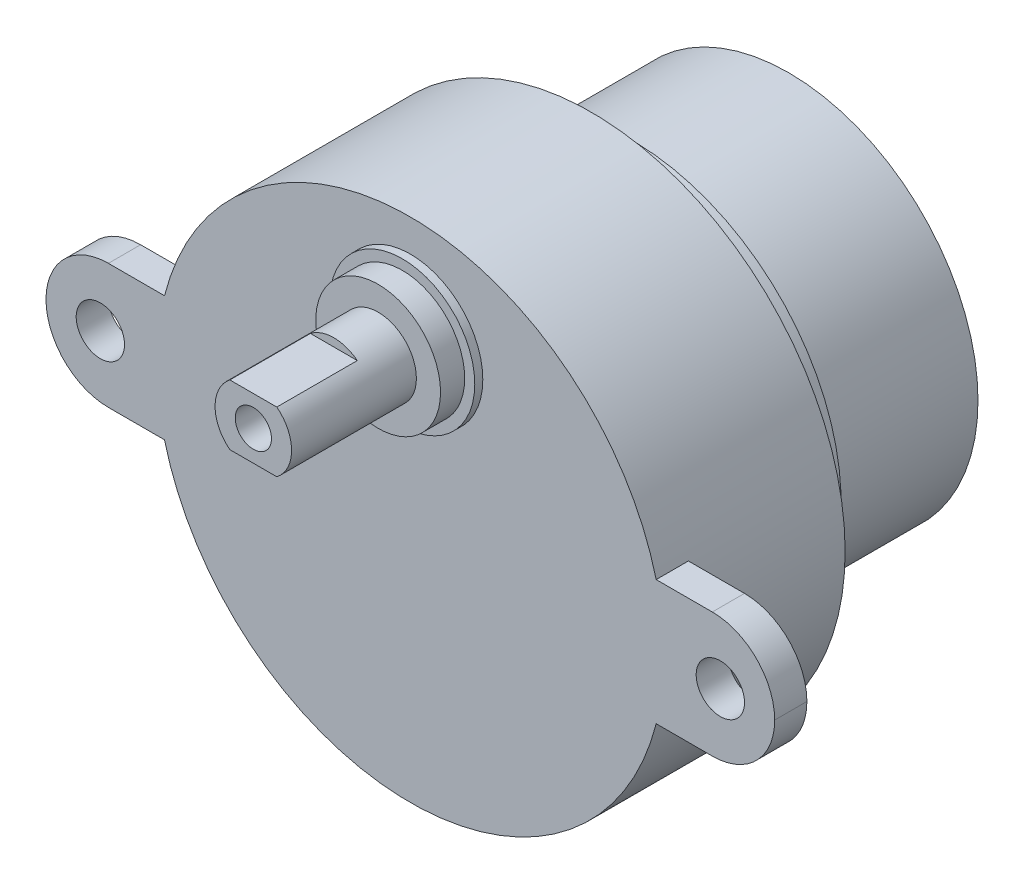
ISO-10303-21;
HEADER;
FILE_DESCRIPTION(('STEP AP214'),'2;1');
FILE_NAME('part.step','',(''),(''),'','','');
FILE_SCHEMA(('AUTOMOTIVE_DESIGN { 1 0 10303 214 1 1 1 1 }'));
ENDSEC;
DATA;
#1=APPLICATION_CONTEXT('core data for automotive mechanical design processes');
#2=APPLICATION_PROTOCOL_DEFINITION('international standard','automotive_design',2000,#1);
#3=PRODUCT_CONTEXT('',#1,'mechanical');
#4=PRODUCT('Part','Part','',(#3));
#5=PRODUCT_RELATED_PRODUCT_CATEGORY('part','',(#4));
#6=PRODUCT_DEFINITION_FORMATION('','',#4);
#7=PRODUCT_DEFINITION_CONTEXT('part definition',#1,'design');
#8=PRODUCT_DEFINITION('design','',#6,#7);
#9=PRODUCT_DEFINITION_SHAPE('','',#8);
#10=(LENGTH_UNIT() NAMED_UNIT(*) SI_UNIT(.MILLI.,.METRE.));
#11=(NAMED_UNIT(*) PLANE_ANGLE_UNIT() SI_UNIT($,.RADIAN.));
#12=(NAMED_UNIT(*) SI_UNIT($,.STERADIAN.) SOLID_ANGLE_UNIT());
#13=UNCERTAINTY_MEASURE_WITH_UNIT(LENGTH_MEASURE(1.E-05),#10,'distance_accuracy_value','');
#14=(GEOMETRIC_REPRESENTATION_CONTEXT(3) GLOBAL_UNCERTAINTY_ASSIGNED_CONTEXT((#13)) GLOBAL_UNIT_ASSIGNED_CONTEXT((#10,
#11,#12)) REPRESENTATION_CONTEXT('',''));
#15=CARTESIAN_POINT('',(0.,0.,0.));
#16=DIRECTION('',(0.,0.,1.));
#17=DIRECTION('',(1.,0.,0.));
#18=AXIS2_PLACEMENT_3D('',#15,#16,#17);
#19=CARTESIAN_POINT('',(0.,0.,-13.97));
#20=DIRECTION('',(0.,0.,1.));
#21=DIRECTION('',(1.,0.,0.));
#22=AXIS2_PLACEMENT_3D('',#19,#20,#21);
#23=PLANE('',#22);
#24=CARTESIAN_POINT('',(0.,0.,-13.97));
#25=DIRECTION('',(0.,0.,-1.));
#26=DIRECTION('',(-1.,0.,0.));
#27=AXIS2_PLACEMENT_3D('',#24,#25,#26);
#28=CIRCLE('',#27,11.938);
#29=CARTESIAN_POINT('',(-11.938,0.,-13.97));
#30=VERTEX_POINT('',#29);
#31=EDGE_CURVE('E244',#30,#30,#28,.T.);
#32=ORIENTED_EDGE('',*,*,#31,.F.);
#33=EDGE_LOOP('',(#32));
#34=FACE_BOUND('',#33,.T.);
#35=CARTESIAN_POINT('',(0.,0.,-13.97));
#36=DIRECTION('',(0.,0.,-1.));
#37=DIRECTION('',(-1.,0.,0.));
#38=AXIS2_PLACEMENT_3D('',#35,#36,#37);
#39=CIRCLE('',#38,13.208);
#40=CARTESIAN_POINT('',(-13.208,0.,-13.97));
#41=VERTEX_POINT('',#40);
#42=EDGE_CURVE('E227',#41,#41,#39,.T.);
#43=ORIENTED_EDGE('',*,*,#42,.T.);
#44=EDGE_LOOP('',(#43));
#45=FACE_BOUND('',#44,.T.);
#46=ADVANCED_FACE('F51',(#34,#45),#23,.F.);
#47=CARTESIAN_POINT('',(0.,0.,-23.876));
#48=DIRECTION('',(0.,0.,1.));
#49=DIRECTION('',(1.,0.,0.));
#50=AXIS2_PLACEMENT_3D('',#47,#48,#49);
#51=CYLINDRICAL_SURFACE('',#50,11.938);
#52=CARTESIAN_POINT('',(0.,0.,-23.876));
#53=DIRECTION('',(0.,0.,-1.));
#54=DIRECTION('',(-1.,0.,0.));
#55=AXIS2_PLACEMENT_3D('',#52,#53,#54);
#56=CIRCLE('',#55,11.938);
#57=CARTESIAN_POINT('',(-11.938,0.,-23.876));
#58=VERTEX_POINT('',#57);
#59=EDGE_CURVE('E240',#58,#58,#56,.T.);
#60=ORIENTED_EDGE('',*,*,#59,.F.);
#61=EDGE_LOOP('',(#60));
#62=FACE_BOUND('',#61,.T.);
#63=ORIENTED_EDGE('',*,*,#31,.T.);
#64=EDGE_LOOP('',(#63));
#65=FACE_BOUND('',#64,.T.);
#66=ADVANCED_FACE('F314',(#62,#65),#51,.T.);
#67=CARTESIAN_POINT('',(0.,0.,-23.876));
#68=DIRECTION('',(0.,0.,-1.));
#69=DIRECTION('',(-1.,0.,0.));
#70=AXIS2_PLACEMENT_3D('',#67,#68,#69);
#71=PLANE('',#70);
#72=ORIENTED_EDGE('',*,*,#59,.T.);
#73=EDGE_LOOP('',(#72));
#74=FACE_BOUND('',#73,.T.);
#75=ADVANCED_FACE('F321',(#74),#71,.T.);
#76=CARTESIAN_POINT('',(0.,0.,-11.43));
#77=DIRECTION('',(0.,0.,-1.));
#78=DIRECTION('',(-1.,0.,0.));
#79=AXIS2_PLACEMENT_3D('',#76,#77,#78);
#80=PLANE('',#79);
#81=CARTESIAN_POINT('',(0.,0.,-11.43));
#82=DIRECTION('',(0.,0.,-1.));
#83=DIRECTION('',(-1.,0.,0.));
#84=AXIS2_PLACEMENT_3D('',#81,#82,#83);
#85=CIRCLE('',#84,13.208);
#86=CARTESIAN_POINT('',(-13.208,0.,-11.43));
#87=VERTEX_POINT('',#86);
#88=EDGE_CURVE('E232',#87,#87,#85,.T.);
#89=ORIENTED_EDGE('',*,*,#88,.F.);
#90=EDGE_LOOP('',(#89));
#91=FACE_BOUND('',#90,.T.);
#92=CARTESIAN_POINT('',(0.,0.,-11.43));
#93=DIRECTION('',(0.,0.,-1.));
#94=DIRECTION('',(-1.,0.,0.));
#95=AXIS2_PLACEMENT_3D('',#92,#93,#94);
#96=CIRCLE('',#95,16.002);
#97=CARTESIAN_POINT('',(-16.002,0.,-11.43));
#98=VERTEX_POINT('',#97);
#99=EDGE_CURVE('E235',#98,#98,#96,.T.);
#100=ORIENTED_EDGE('',*,*,#99,.T.);
#101=EDGE_LOOP('',(#100));
#102=FACE_BOUND('',#101,.T.);
#103=ADVANCED_FACE('F640',(#91,#102),#80,.T.);
#104=CARTESIAN_POINT('',(0.,0.,-11.43));
#105=DIRECTION('',(0.,0.,-1.));
#106=DIRECTION('',(-1.,0.,0.));
#107=AXIS2_PLACEMENT_3D('',#104,#105,#106);
#108=CYLINDRICAL_SURFACE('',#107,13.208);
#109=ORIENTED_EDGE('',*,*,#88,.T.);
#110=EDGE_LOOP('',(#109));
#111=FACE_BOUND('',#110,.T.);
#112=ORIENTED_EDGE('',*,*,#42,.F.);
#113=EDGE_LOOP('',(#112));
#114=FACE_BOUND('',#113,.T.);
#115=ADVANCED_FACE('F330',(#111,#114),#108,.T.);
#116=CARTESIAN_POINT('',(0.,0.,0.));
#117=DIRECTION('',(0.,0.,1.));
#118=DIRECTION('',(1.,0.,0.));
#119=AXIS2_PLACEMENT_3D('',#116,#117,#118);
#120=PLANE('',#119);
#121=CARTESIAN_POINT('',(0.,9.398,0.));
#122=DIRECTION('',(0.,0.,1.));
#123=DIRECTION('',(1.,0.,0.));
#124=AXIS2_PLACEMENT_3D('',#121,#122,#123);
#125=CIRCLE('',#124,4.572);
#126=CARTESIAN_POINT('',(4.572,9.398,0.));
#127=VERTEX_POINT('',#126);
#128=EDGE_CURVE('E192',#127,#127,#125,.T.);
#129=ORIENTED_EDGE('',*,*,#128,.F.);
#130=EDGE_LOOP('',(#129));
#131=FACE_BOUND('',#130,.T.);
#132=CARTESIAN_POINT('',(-19.558,0.,0.));
#133=DIRECTION('',(0.,0.,1.));
#134=DIRECTION('',(1.,0.,0.));
#135=AXIS2_PLACEMENT_3D('',#132,#133,#134);
#136=CIRCLE('',#135,1.524);
#137=CARTESIAN_POINT('',(-18.034,0.,0.));
#138=VERTEX_POINT('',#137);
#139=EDGE_CURVE('E216',#138,#138,#136,.T.);
#140=ORIENTED_EDGE('',*,*,#139,.F.);
#141=EDGE_LOOP('',(#140));
#142=FACE_BOUND('',#141,.T.);
#143=CARTESIAN_POINT('',(19.558,0.,0.));
#144=DIRECTION('',(0.,0.,1.));
#145=DIRECTION('',(1.,0.,0.));
#146=AXIS2_PLACEMENT_3D('',#143,#144,#145);
#147=CIRCLE('',#146,1.524);
#148=CARTESIAN_POINT('',(21.082,0.,0.));
#149=VERTEX_POINT('',#148);
#150=EDGE_CURVE('E220',#149,#149,#147,.T.);
#151=ORIENTED_EDGE('',*,*,#150,.F.);
#152=EDGE_LOOP('',(#151));
#153=FACE_BOUND('',#152,.T.);
#154=CARTESIAN_POINT('',(19.05,0.,0.));
#155=DIRECTION('',(0.,0.,1.));
#156=DIRECTION('',(1.,0.,0.));
#157=AXIS2_PLACEMENT_3D('',#154,#155,#156);
#158=CIRCLE('',#157,3.937);
#159=CARTESIAN_POINT('',(19.05,-3.937,0.));
#160=VERTEX_POINT('',#159);
#161=CARTESIAN_POINT('',(22.987,0.,0.));
#162=VERTEX_POINT('',#161);
#163=EDGE_CURVE('E270',#160,#162,#158,.T.);
#164=ORIENTED_EDGE('',*,*,#163,.T.);
#165=CARTESIAN_POINT('',(19.05,0.,0.));
#166=DIRECTION('',(0.,0.,1.));
#167=DIRECTION('',(1.,0.,0.));
#168=AXIS2_PLACEMENT_3D('',#165,#166,#167);
#169=CIRCLE('',#168,3.937);
#170=CARTESIAN_POINT('',(19.05,3.937,0.));
#171=VERTEX_POINT('',#170);
#172=EDGE_CURVE('E272',#162,#171,#169,.T.);
#173=ORIENTED_EDGE('',*,*,#172,.T.);
#174=DIRECTION('',(-1.,0.,0.));
#175=VECTOR('',#174,1.);
#176=CARTESIAN_POINT('',(-22.987,3.937,0.));
#177=LINE('',#176,#175);
#178=CARTESIAN_POINT('',(15.5101268531241,3.937,0.));
#179=VERTEX_POINT('',#178);
#180=EDGE_CURVE('E228',#171,#179,#177,.T.);
#181=ORIENTED_EDGE('',*,*,#180,.T.);
#182=CARTESIAN_POINT('',(0.,0.,0.));
#183=DIRECTION('',(0.,0.,1.));
#184=DIRECTION('',(1.,0.,0.));
#185=AXIS2_PLACEMENT_3D('',#182,#183,#184);
#186=CIRCLE('',#185,16.002);
#187=CARTESIAN_POINT('',(-15.5101268531241,3.937,0.));
#188=VERTEX_POINT('',#187);
#189=EDGE_CURVE('E248',#179,#188,#186,.T.);
#190=ORIENTED_EDGE('',*,*,#189,.T.);
#191=CARTESIAN_POINT('',(-19.05,3.937,0.));
#192=VERTEX_POINT('',#191);
#193=EDGE_CURVE('E222',#188,#192,#177,.T.);
#194=ORIENTED_EDGE('',*,*,#193,.T.);
#195=CARTESIAN_POINT('',(-19.05,0.,0.));
#196=DIRECTION('',(0.,0.,1.));
#197=DIRECTION('',(1.,0.,0.));
#198=AXIS2_PLACEMENT_3D('',#195,#196,#197);
#199=CIRCLE('',#198,3.937);
#200=CARTESIAN_POINT('',(-22.987,0.,0.));
#201=VERTEX_POINT('',#200);
#202=EDGE_CURVE('E178',#192,#201,#199,.T.);
#203=ORIENTED_EDGE('',*,*,#202,.T.);
#204=CARTESIAN_POINT('',(-19.05,0.,0.));
#205=DIRECTION('',(0.,0.,1.));
#206=DIRECTION('',(1.,0.,0.));
#207=AXIS2_PLACEMENT_3D('',#204,#205,#206);
#208=CIRCLE('',#207,3.937);
#209=CARTESIAN_POINT('',(-19.05,-3.937,0.));
#210=VERTEX_POINT('',#209);
#211=EDGE_CURVE('E268',#201,#210,#208,.T.);
#212=ORIENTED_EDGE('',*,*,#211,.T.);
#213=DIRECTION('',(1.,0.,0.));
#214=VECTOR('',#213,1.);
#215=CARTESIAN_POINT('',(-22.987,-3.937,0.));
#216=LINE('',#215,#214);
#217=CARTESIAN_POINT('',(-15.5101268531241,-3.937,0.));
#218=VERTEX_POINT('',#217);
#219=EDGE_CURVE('E175',#210,#218,#216,.T.);
#220=ORIENTED_EDGE('',*,*,#219,.T.);
#221=CARTESIAN_POINT('',(15.5101268531241,-3.937,0.));
#222=VERTEX_POINT('',#221);
#223=EDGE_CURVE('E243',#218,#222,#186,.T.);
#224=ORIENTED_EDGE('',*,*,#223,.T.);
#225=EDGE_CURVE('E230',#222,#160,#216,.T.);
#226=ORIENTED_EDGE('',*,*,#225,.T.);
#227=EDGE_LOOP('',(#164,#173,#181,#190,#194,#203,#212,#220,#224,#226));
#228=FACE_BOUND('',#227,.T.);
#229=ADVANCED_FACE('F299',(#131,#142,#153,#228),#120,.T.);
#230=CARTESIAN_POINT('',(0.,0.,-13.97));
#231=DIRECTION('',(0.,0.,1.));
#232=DIRECTION('',(1.,0.,0.));
#233=AXIS2_PLACEMENT_3D('',#230,#231,#232);
#234=CYLINDRICAL_SURFACE('',#233,16.002);
#235=DIRECTION('',(0.,0.,1.));
#236=VECTOR('',#235,1.);
#237=CARTESIAN_POINT('',(-15.5101268531241,-3.937,-13.97));
#238=LINE('',#237,#236);
#239=CARTESIAN_POINT('',(-15.5101268531241,-3.937,-2.032));
#240=VERTEX_POINT('',#239);
#241=EDGE_CURVE('E260',#240,#218,#238,.T.);
#242=ORIENTED_EDGE('',*,*,#241,.F.);
#243=CARTESIAN_POINT('',(0.,0.,-2.032));
#244=DIRECTION('',(0.,0.,1.));
#245=DIRECTION('',(1.,0.,0.));
#246=AXIS2_PLACEMENT_3D('',#243,#244,#245);
#247=CIRCLE('',#246,16.002);
#248=CARTESIAN_POINT('',(-15.5101268531241,3.937,-2.032));
#249=VERTEX_POINT('',#248);
#250=EDGE_CURVE('E254',#240,#249,#247,.F.);
#251=ORIENTED_EDGE('',*,*,#250,.T.);
#252=DIRECTION('',(0.,0.,1.));
#253=VECTOR('',#252,1.);
#254=CARTESIAN_POINT('',(-15.5101268531241,3.937,-13.97));
#255=LINE('',#254,#253);
#256=EDGE_CURVE('E173',#188,#249,#255,.F.);
#257=ORIENTED_EDGE('',*,*,#256,.F.);
#258=ORIENTED_EDGE('',*,*,#189,.F.);
#259=DIRECTION('',(0.,0.,1.));
#260=VECTOR('',#259,1.);
#261=CARTESIAN_POINT('',(15.5101268531241,3.937,-13.97));
#262=LINE('',#261,#260);
#263=CARTESIAN_POINT('',(15.5101268531241,3.937,-2.032));
#264=VERTEX_POINT('',#263);
#265=EDGE_CURVE('E253',#264,#179,#262,.T.);
#266=ORIENTED_EDGE('',*,*,#265,.F.);
#267=CARTESIAN_POINT('',(15.5101268531241,-3.937,-2.032));
#268=VERTEX_POINT('',#267);
#269=EDGE_CURVE('E247',#264,#268,#247,.F.);
#270=ORIENTED_EDGE('',*,*,#269,.T.);
#271=DIRECTION('',(0.,0.,1.));
#272=VECTOR('',#271,1.);
#273=CARTESIAN_POINT('',(15.5101268531241,-3.937,-13.97));
#274=LINE('',#273,#272);
#275=EDGE_CURVE('E257',#222,#268,#274,.F.);
#276=ORIENTED_EDGE('',*,*,#275,.F.);
#277=ORIENTED_EDGE('',*,*,#223,.F.);
#278=EDGE_LOOP('',(#242,#251,#257,#258,#266,#270,#276,#277));
#279=FACE_BOUND('',#278,.T.);
#280=ORIENTED_EDGE('',*,*,#99,.F.);
#281=EDGE_LOOP('',(#280));
#282=FACE_BOUND('',#281,.T.);
#283=ADVANCED_FACE('F293',(#279,#282),#234,.T.);
#284=CARTESIAN_POINT('',(0.,0.,-2.032));
#285=DIRECTION('',(0.,0.,1.));
#286=DIRECTION('',(1.,0.,0.));
#287=AXIS2_PLACEMENT_3D('',#284,#285,#286);
#288=PLANE('',#287);
#289=CARTESIAN_POINT('',(19.558,0.,-2.032));
#290=DIRECTION('',(0.,0.,1.));
#291=DIRECTION('',(1.,0.,0.));
#292=AXIS2_PLACEMENT_3D('',#289,#290,#291);
#293=CIRCLE('',#292,1.524);
#294=CARTESIAN_POINT('',(21.082,0.,-2.032));
#295=VERTEX_POINT('',#294);
#296=EDGE_CURVE('E219',#295,#295,#293,.T.);
#297=ORIENTED_EDGE('',*,*,#296,.T.);
#298=EDGE_LOOP('',(#297));
#299=FACE_BOUND('',#298,.T.);
#300=DIRECTION('',(-1.,0.,0.));
#301=VECTOR('',#300,1.);
#302=CARTESIAN_POINT('',(-22.987,3.937,-2.032));
#303=LINE('',#302,#301);
#304=CARTESIAN_POINT('',(19.05,3.937,-2.032));
#305=VERTEX_POINT('',#304);
#306=EDGE_CURVE('E174',#305,#264,#303,.T.);
#307=ORIENTED_EDGE('',*,*,#306,.F.);
#308=CARTESIAN_POINT('',(19.05,0.,-2.032));
#309=DIRECTION('',(0.,0.,1.));
#310=DIRECTION('',(1.,0.,0.));
#311=AXIS2_PLACEMENT_3D('',#308,#309,#310);
#312=CIRCLE('',#311,3.937);
#313=CARTESIAN_POINT('',(22.987,0.,-2.032));
#314=VERTEX_POINT('',#313);
#315=EDGE_CURVE('E279',#305,#314,#312,.F.);
#316=ORIENTED_EDGE('',*,*,#315,.T.);
#317=CARTESIAN_POINT('',(19.05,0.,-2.032));
#318=DIRECTION('',(0.,0.,1.));
#319=DIRECTION('',(1.,0.,0.));
#320=AXIS2_PLACEMENT_3D('',#317,#318,#319);
#321=CIRCLE('',#320,3.937);
#322=CARTESIAN_POINT('',(19.05,-3.937,-2.032));
#323=VERTEX_POINT('',#322);
#324=EDGE_CURVE('E277',#314,#323,#321,.F.);
#325=ORIENTED_EDGE('',*,*,#324,.T.);
#326=DIRECTION('',(1.,0.,0.));
#327=VECTOR('',#326,1.);
#328=CARTESIAN_POINT('',(-22.987,-3.937,-2.032));
#329=LINE('',#328,#327);
#330=EDGE_CURVE('E224',#268,#323,#329,.T.);
#331=ORIENTED_EDGE('',*,*,#330,.F.);
#332=ORIENTED_EDGE('',*,*,#269,.F.);
#333=EDGE_LOOP('',(#307,#316,#325,#331,#332));
#334=FACE_BOUND('',#333,.T.);
#335=ADVANCED_FACE('F334',(#299,#334),#288,.F.);
#336=CARTESIAN_POINT('',(-22.987,3.937,-2.032));
#337=DIRECTION('',(0.,1.,0.));
#338=DIRECTION('',(0.,0.,1.));
#339=AXIS2_PLACEMENT_3D('',#336,#337,#338);
#340=PLANE('',#339);
#341=ORIENTED_EDGE('',*,*,#180,.F.);
#342=DIRECTION('',(0.,0.,1.));
#343=VECTOR('',#342,1.);
#344=CARTESIAN_POINT('',(19.05,3.937,-2.032));
#345=LINE('',#344,#343);
#346=EDGE_CURVE('E274',#171,#305,#345,.F.);
#347=ORIENTED_EDGE('',*,*,#346,.T.);
#348=ORIENTED_EDGE('',*,*,#306,.T.);
#349=ORIENTED_EDGE('',*,*,#265,.T.);
#350=EDGE_LOOP('',(#341,#347,#348,#349));
#351=FACE_BOUND('',#350,.T.);
#352=ADVANCED_FACE('F361',(#351),#340,.T.);
#353=CARTESIAN_POINT('',(-22.987,-3.937,-2.032));
#354=DIRECTION('',(0.,-1.,0.));
#355=DIRECTION('',(0.,0.,-1.));
#356=AXIS2_PLACEMENT_3D('',#353,#354,#355);
#357=PLANE('',#356);
#358=ORIENTED_EDGE('',*,*,#330,.T.);
#359=DIRECTION('',(0.,0.,1.));
#360=VECTOR('',#359,1.);
#361=CARTESIAN_POINT('',(19.05,-3.937,-2.032));
#362=LINE('',#361,#360);
#363=EDGE_CURVE('E281',#323,#160,#362,.T.);
#364=ORIENTED_EDGE('',*,*,#363,.T.);
#365=ORIENTED_EDGE('',*,*,#225,.F.);
#366=ORIENTED_EDGE('',*,*,#275,.T.);
#367=EDGE_LOOP('',(#358,#364,#365,#366));
#368=FACE_BOUND('',#367,.T.);
#369=ADVANCED_FACE('F352',(#368),#357,.T.);
#370=CARTESIAN_POINT('',(-19.05,3.937,-2.032));
#371=VERTEX_POINT('',#370);
#372=EDGE_CURVE('E160',#249,#371,#303,.T.);
#373=ORIENTED_EDGE('',*,*,#372,.T.);
#374=DIRECTION('',(0.,0.,1.));
#375=VECTOR('',#374,1.);
#376=CARTESIAN_POINT('',(-19.05,3.937,-2.032));
#377=LINE('',#376,#375);
#378=EDGE_CURVE('E170',#371,#192,#377,.T.);
#379=ORIENTED_EDGE('',*,*,#378,.T.);
#380=ORIENTED_EDGE('',*,*,#193,.F.);
#381=ORIENTED_EDGE('',*,*,#256,.T.);
#382=EDGE_LOOP('',(#373,#379,#380,#381));
#383=FACE_BOUND('',#382,.T.);
#384=ADVANCED_FACE('F169',(#383),#340,.T.);
#385=CARTESIAN_POINT('',(-19.558,0.,-2.032));
#386=DIRECTION('',(0.,0.,1.));
#387=DIRECTION('',(1.,0.,0.));
#388=AXIS2_PLACEMENT_3D('',#385,#386,#387);
#389=CIRCLE('',#388,1.524);
#390=CARTESIAN_POINT('',(-18.034,0.,-2.032));
#391=VERTEX_POINT('',#390);
#392=EDGE_CURVE('E185',#391,#391,#389,.T.);
#393=ORIENTED_EDGE('',*,*,#392,.T.);
#394=EDGE_LOOP('',(#393));
#395=FACE_BOUND('',#394,.T.);
#396=CARTESIAN_POINT('',(-19.05,-3.937,-2.032));
#397=VERTEX_POINT('',#396);
#398=EDGE_CURVE('E225',#397,#240,#329,.T.);
#399=ORIENTED_EDGE('',*,*,#398,.F.);
#400=CARTESIAN_POINT('',(-19.05,0.,-2.032));
#401=DIRECTION('',(0.,0.,1.));
#402=DIRECTION('',(1.,0.,0.));
#403=AXIS2_PLACEMENT_3D('',#400,#401,#402);
#404=CIRCLE('',#403,3.937);
#405=CARTESIAN_POINT('',(-22.987,0.,-2.032));
#406=VERTEX_POINT('',#405);
#407=EDGE_CURVE('E153',#397,#406,#404,.F.);
#408=ORIENTED_EDGE('',*,*,#407,.T.);
#409=CARTESIAN_POINT('',(-19.05,0.,-2.032));
#410=DIRECTION('',(0.,0.,1.));
#411=DIRECTION('',(1.,0.,0.));
#412=AXIS2_PLACEMENT_3D('',#409,#410,#411);
#413=CIRCLE('',#412,3.937);
#414=EDGE_CURVE('E156',#406,#371,#413,.F.);
#415=ORIENTED_EDGE('',*,*,#414,.T.);
#416=ORIENTED_EDGE('',*,*,#372,.F.);
#417=ORIENTED_EDGE('',*,*,#250,.F.);
#418=EDGE_LOOP('',(#399,#408,#415,#416,#417));
#419=FACE_BOUND('',#418,.T.);
#420=ADVANCED_FACE('F158',(#395,#419),#288,.F.);
#421=ORIENTED_EDGE('',*,*,#219,.F.);
#422=DIRECTION('',(0.,0.,1.));
#423=VECTOR('',#422,1.);
#424=CARTESIAN_POINT('',(-19.05,-3.937,-2.032));
#425=LINE('',#424,#423);
#426=EDGE_CURVE('E166',#210,#397,#425,.F.);
#427=ORIENTED_EDGE('',*,*,#426,.T.);
#428=ORIENTED_EDGE('',*,*,#398,.T.);
#429=ORIENTED_EDGE('',*,*,#241,.T.);
#430=EDGE_LOOP('',(#421,#427,#428,#429));
#431=FACE_BOUND('',#430,.T.);
#432=ADVANCED_FACE('F287',(#431),#357,.T.);
#433=CARTESIAN_POINT('',(-19.558,0.,-23.876));
#434=DIRECTION('',(0.,0.,1.));
#435=DIRECTION('',(1.,0.,0.));
#436=AXIS2_PLACEMENT_3D('',#433,#434,#435);
#437=CYLINDRICAL_SURFACE('',#436,1.524);
#438=ORIENTED_EDGE('',*,*,#139,.T.);
#439=EDGE_LOOP('',(#438));
#440=FACE_BOUND('',#439,.T.);
#441=ORIENTED_EDGE('',*,*,#392,.F.);
#442=EDGE_LOOP('',(#441));
#443=FACE_BOUND('',#442,.T.);
#444=ADVANCED_FACE('F344',(#440,#443),#437,.F.);
#445=CARTESIAN_POINT('',(19.558,0.,-23.876));
#446=DIRECTION('',(0.,0.,1.));
#447=DIRECTION('',(1.,0.,0.));
#448=AXIS2_PLACEMENT_3D('',#445,#446,#447);
#449=CYLINDRICAL_SURFACE('',#448,1.524);
#450=ORIENTED_EDGE('',*,*,#150,.T.);
#451=EDGE_LOOP('',(#450));
#452=FACE_BOUND('',#451,.T.);
#453=ORIENTED_EDGE('',*,*,#296,.F.);
#454=EDGE_LOOP('',(#453));
#455=FACE_BOUND('',#454,.T.);
#456=ADVANCED_FACE('F339',(#452,#455),#449,.F.);
#457=CARTESIAN_POINT('',(19.05,0.,-2.032));
#458=DIRECTION('',(0.,0.,1.));
#459=DIRECTION('',(1.,0.,0.));
#460=AXIS2_PLACEMENT_3D('',#457,#458,#459);
#461=CYLINDRICAL_SURFACE('',#460,3.937);
#462=ORIENTED_EDGE('',*,*,#363,.F.);
#463=ORIENTED_EDGE('',*,*,#324,.F.);
#464=DIRECTION('',(0.,0.,1.));
#465=VECTOR('',#464,1.);
#466=CARTESIAN_POINT('',(22.987,0.,-2.032));
#467=LINE('',#466,#465);
#468=EDGE_CURVE('E182',#162,#314,#467,.F.);
#469=ORIENTED_EDGE('',*,*,#468,.F.);
#470=ORIENTED_EDGE('',*,*,#163,.F.);
#471=EDGE_LOOP('',(#462,#463,#469,#470));
#472=FACE_BOUND('',#471,.T.);
#473=ADVANCED_FACE('F336',(#472),#461,.T.);
#474=CARTESIAN_POINT('',(19.05,0.,-2.032));
#475=DIRECTION('',(0.,0.,1.));
#476=DIRECTION('',(1.,0.,0.));
#477=AXIS2_PLACEMENT_3D('',#474,#475,#476);
#478=CYLINDRICAL_SURFACE('',#477,3.937);
#479=ORIENTED_EDGE('',*,*,#315,.F.);
#480=ORIENTED_EDGE('',*,*,#346,.F.);
#481=ORIENTED_EDGE('',*,*,#172,.F.);
#482=ORIENTED_EDGE('',*,*,#468,.T.);
#483=EDGE_LOOP('',(#479,#480,#481,#482));
#484=FACE_BOUND('',#483,.T.);
#485=ADVANCED_FACE('F311',(#484),#478,.T.);
#486=CARTESIAN_POINT('',(-19.05,0.,-2.032));
#487=DIRECTION('',(0.,0.,1.));
#488=DIRECTION('',(1.,0.,0.));
#489=AXIS2_PLACEMENT_3D('',#486,#487,#488);
#490=CYLINDRICAL_SURFACE('',#489,3.937);
#491=ORIENTED_EDGE('',*,*,#378,.F.);
#492=ORIENTED_EDGE('',*,*,#414,.F.);
#493=DIRECTION('',(0.,0.,1.));
#494=VECTOR('',#493,1.);
#495=CARTESIAN_POINT('',(-22.987,0.,-2.032));
#496=LINE('',#495,#494);
#497=EDGE_CURVE('E186',#201,#406,#496,.F.);
#498=ORIENTED_EDGE('',*,*,#497,.F.);
#499=ORIENTED_EDGE('',*,*,#202,.F.);
#500=EDGE_LOOP('',(#491,#492,#498,#499));
#501=FACE_BOUND('',#500,.T.);
#502=ADVANCED_FACE('F53',(#501),#490,.T.);
#503=CARTESIAN_POINT('',(-19.05,0.,-2.032));
#504=DIRECTION('',(0.,0.,1.));
#505=DIRECTION('',(1.,0.,0.));
#506=AXIS2_PLACEMENT_3D('',#503,#504,#505);
#507=CYLINDRICAL_SURFACE('',#506,3.937);
#508=ORIENTED_EDGE('',*,*,#407,.F.);
#509=ORIENTED_EDGE('',*,*,#426,.F.);
#510=ORIENTED_EDGE('',*,*,#211,.F.);
#511=ORIENTED_EDGE('',*,*,#497,.T.);
#512=EDGE_LOOP('',(#508,#509,#510,#511));
#513=FACE_BOUND('',#512,.T.);
#514=ADVANCED_FACE('F301',(#513),#507,.T.);
#515=CARTESIAN_POINT('',(0.,9.398,0.508));
#516=DIRECTION('',(0.,0.,-1.));
#517=DIRECTION('',(-1.,0.,0.));
#518=AXIS2_PLACEMENT_3D('',#515,#516,#517);
#519=CYLINDRICAL_SURFACE('',#518,4.572);
#520=CARTESIAN_POINT('',(0.,9.398,0.508));
#521=DIRECTION('',(0.,0.,1.));
#522=DIRECTION('',(1.,0.,0.));
#523=AXIS2_PLACEMENT_3D('',#520,#521,#522);
#524=CIRCLE('',#523,4.572);
#525=CARTESIAN_POINT('',(4.572,9.398,0.508));
#526=VERTEX_POINT('',#525);
#527=EDGE_CURVE('E188',#526,#526,#524,.T.);
#528=ORIENTED_EDGE('',*,*,#527,.F.);
#529=EDGE_LOOP('',(#528));
#530=FACE_BOUND('',#529,.T.);
#531=ORIENTED_EDGE('',*,*,#128,.T.);
#532=EDGE_LOOP('',(#531));
#533=FACE_BOUND('',#532,.T.);
#534=ADVANCED_FACE('F303',(#530,#533),#519,.T.);
#535=CARTESIAN_POINT('',(0.,9.398,0.508));
#536=DIRECTION('',(0.,0.,1.));
#537=DIRECTION('',(1.,0.,0.));
#538=AXIS2_PLACEMENT_3D('',#535,#536,#537);
#539=PLANE('',#538);
#540=CARTESIAN_POINT('',(0.,9.398,0.508));
#541=DIRECTION('',(0.,0.,1.));
#542=DIRECTION('',(1.,0.,0.));
#543=AXIS2_PLACEMENT_3D('',#540,#541,#542);
#544=CIRCLE('',#543,3.937);
#545=CARTESIAN_POINT('',(3.937,9.398,0.508));
#546=VERTEX_POINT('',#545);
#547=EDGE_CURVE('E189',#546,#546,#544,.F.);
#548=ORIENTED_EDGE('',*,*,#547,.T.);
#549=EDGE_LOOP('',(#548));
#550=FACE_BOUND('',#549,.T.);
#551=ORIENTED_EDGE('',*,*,#527,.T.);
#552=EDGE_LOOP('',(#551));
#553=FACE_BOUND('',#552,.T.);
#554=ADVANCED_FACE('F308',(#550,#553),#539,.T.);
#555=CARTESIAN_POINT('',(0.,9.398,2.032));
#556=DIRECTION('',(0.,0.,-1.));
#557=DIRECTION('',(-1.,0.,0.));
#558=AXIS2_PLACEMENT_3D('',#555,#556,#557);
#559=CYLINDRICAL_SURFACE('',#558,3.937);
#560=ORIENTED_EDGE('',*,*,#547,.F.);
#561=EDGE_LOOP('',(#560));
#562=FACE_BOUND('',#561,.T.);
#563=CARTESIAN_POINT('',(0.,9.398,2.032));
#564=DIRECTION('',(0.,0.,1.));
#565=DIRECTION('',(1.,0.,0.));
#566=AXIS2_PLACEMENT_3D('',#563,#564,#565);
#567=CIRCLE('',#566,3.937);
#568=CARTESIAN_POINT('',(3.937,9.398,2.032));
#569=VERTEX_POINT('',#568);
#570=EDGE_CURVE('E193',#569,#569,#567,.T.);
#571=ORIENTED_EDGE('',*,*,#570,.F.);
#572=EDGE_LOOP('',(#571));
#573=FACE_BOUND('',#572,.T.);
#574=ADVANCED_FACE('F388',(#562,#573),#559,.T.);
#575=CARTESIAN_POINT('',(0.,9.398,2.032));
#576=DIRECTION('',(0.,0.,1.));
#577=DIRECTION('',(1.,0.,0.));
#578=AXIS2_PLACEMENT_3D('',#575,#576,#577);
#579=PLANE('',#578);
#580=CARTESIAN_POINT('',(0.,9.398,2.032));
#581=DIRECTION('',(0.,0.,1.));
#582=DIRECTION('',(1.,0.,0.));
#583=AXIS2_PLACEMENT_3D('',#580,#581,#582);
#584=CIRCLE('',#583,2.413);
#585=CARTESIAN_POINT('',(2.413,9.398,2.032));
#586=VERTEX_POINT('',#585);
#587=EDGE_CURVE('E194',#586,#586,#584,.F.);
#588=ORIENTED_EDGE('',*,*,#587,.T.);
#589=EDGE_LOOP('',(#588));
#590=FACE_BOUND('',#589,.T.);
#591=ORIENTED_EDGE('',*,*,#570,.T.);
#592=EDGE_LOOP('',(#591));
#593=FACE_BOUND('',#592,.T.);
#594=ADVANCED_FACE('F392',(#590,#593),#579,.T.);
#595=CARTESIAN_POINT('',(0.,9.398,9.906));
#596=DIRECTION('',(0.,0.,-1.));
#597=DIRECTION('',(-1.,0.,0.));
#598=AXIS2_PLACEMENT_3D('',#595,#596,#597);
#599=CYLINDRICAL_SURFACE('',#598,2.413);
#600=CARTESIAN_POINT('',(0.,9.398,9.906));
#601=DIRECTION('',(0.,0.,1.));
#602=DIRECTION('',(1.,0.,0.));
#603=AXIS2_PLACEMENT_3D('',#600,#601,#602);
#604=CIRCLE('',#603,2.413);
#605=CARTESIAN_POINT('',(-1.48106178129071,11.303,9.906));
#606=VERTEX_POINT('',#605);
#607=CARTESIAN_POINT('',(-1.48106178129071,7.493,9.906));
#608=VERTEX_POINT('',#607);
#609=EDGE_CURVE('E196',#606,#608,#604,.T.);
#610=ORIENTED_EDGE('',*,*,#609,.F.);
#611=DIRECTION('',(0.,0.,1.));
#612=VECTOR('',#611,1.);
#613=CARTESIAN_POINT('',(-1.48106178129071,11.303,4.826));
#614=LINE('',#613,#612);
#615=CARTESIAN_POINT('',(-1.48106178129071,11.303,4.826));
#616=VERTEX_POINT('',#615);
#617=EDGE_CURVE('E441',#616,#606,#614,.T.);
#618=ORIENTED_EDGE('',*,*,#617,.F.);
#619=CARTESIAN_POINT('',(0.,9.398,4.826));
#620=DIRECTION('',(0.,0.,1.));
#621=DIRECTION('',(1.,0.,0.));
#622=AXIS2_PLACEMENT_3D('',#619,#620,#621);
#623=CIRCLE('',#622,2.413);
#624=CARTESIAN_POINT('',(1.48106178129071,11.303,4.826));
#625=VERTEX_POINT('',#624);
#626=EDGE_CURVE('E437',#625,#616,#623,.T.);
#627=ORIENTED_EDGE('',*,*,#626,.F.);
#628=DIRECTION('',(0.,0.,1.));
#629=VECTOR('',#628,1.);
#630=CARTESIAN_POINT('',(1.48106178129071,11.303,4.826));
#631=LINE('',#630,#629);
#632=CARTESIAN_POINT('',(1.48106178129071,11.303,9.906));
#633=VERTEX_POINT('',#632);
#634=EDGE_CURVE('E86',#625,#633,#631,.T.);
#635=ORIENTED_EDGE('',*,*,#634,.T.);
#636=CARTESIAN_POINT('',(1.48106178129071,7.493,9.906));
#637=VERTEX_POINT('',#636);
#638=EDGE_CURVE('E202',#637,#633,#604,.T.);
#639=ORIENTED_EDGE('',*,*,#638,.F.);
#640=DIRECTION('',(0.,0.,1.));
#641=VECTOR('',#640,1.);
#642=CARTESIAN_POINT('',(1.48106178129071,7.493,4.826));
#643=LINE('',#642,#641);
#644=CARTESIAN_POINT('',(1.48106178129071,7.493,4.826));
#645=VERTEX_POINT('',#644);
#646=EDGE_CURVE('E68',#645,#637,#643,.T.);
#647=ORIENTED_EDGE('',*,*,#646,.F.);
#648=CARTESIAN_POINT('',(0.,9.398,4.826));
#649=DIRECTION('',(0.,0.,1.));
#650=DIRECTION('',(1.,0.,0.));
#651=AXIS2_PLACEMENT_3D('',#648,#649,#650);
#652=CIRCLE('',#651,2.413);
#653=CARTESIAN_POINT('',(-1.48106178129071,7.493,4.826));
#654=VERTEX_POINT('',#653);
#655=EDGE_CURVE('E209',#654,#645,#652,.T.);
#656=ORIENTED_EDGE('',*,*,#655,.F.);
#657=DIRECTION('',(0.,0.,1.));
#658=VECTOR('',#657,1.);
#659=CARTESIAN_POINT('',(-1.48106178129071,7.493,4.826));
#660=LINE('',#659,#658);
#661=EDGE_CURVE('E430',#654,#608,#660,.T.);
#662=ORIENTED_EDGE('',*,*,#661,.T.);
#663=EDGE_LOOP('',(#610,#618,#627,#635,#639,#647,#656,#662));
#664=FACE_BOUND('',#663,.T.);
#665=ORIENTED_EDGE('',*,*,#587,.F.);
#666=EDGE_LOOP('',(#665));
#667=FACE_BOUND('',#666,.T.);
#668=ADVANCED_FACE('F396',(#664,#667),#599,.T.);
#669=CARTESIAN_POINT('',(0.,9.398,9.906));
#670=DIRECTION('',(0.,0.,1.));
#671=DIRECTION('',(1.,0.,0.));
#672=AXIS2_PLACEMENT_3D('',#669,#670,#671);
#673=PLANE('',#672);
#674=CARTESIAN_POINT('',(0.,9.398,9.906));
#675=DIRECTION('',(0.,0.,1.));
#676=DIRECTION('',(1.,0.,0.));
#677=AXIS2_PLACEMENT_3D('',#674,#675,#676);
#678=CIRCLE('',#677,1.143);
#679=CARTESIAN_POINT('',(1.143,9.398,9.906));
#680=VERTEX_POINT('',#679);
#681=EDGE_CURVE('E431',#680,#680,#678,.T.);
#682=ORIENTED_EDGE('',*,*,#681,.F.);
#683=EDGE_LOOP('',(#682));
#684=FACE_BOUND('',#683,.T.);
#685=DIRECTION('',(1.,0.,0.));
#686=VECTOR('',#685,1.);
#687=CARTESIAN_POINT('',(-1.48106178129071,11.303,9.906));
#688=LINE('',#687,#686);
#689=EDGE_CURVE('E11',#606,#633,#688,.T.);
#690=ORIENTED_EDGE('',*,*,#689,.F.);
#691=ORIENTED_EDGE('',*,*,#609,.T.);
#692=DIRECTION('',(1.,0.,0.));
#693=VECTOR('',#692,1.);
#694=CARTESIAN_POINT('',(-1.48106178129071,7.493,9.906));
#695=LINE('',#694,#693);
#696=EDGE_CURVE('E60',#637,#608,#695,.F.);
#697=ORIENTED_EDGE('',*,*,#696,.F.);
#698=ORIENTED_EDGE('',*,*,#638,.T.);
#699=EDGE_LOOP('',(#690,#691,#697,#698));
#700=FACE_BOUND('',#699,.T.);
#701=ADVANCED_FACE('F399',(#684,#700),#673,.T.);
#702=CARTESIAN_POINT('',(-1.48106178129071,7.493,4.826));
#703=DIRECTION('',(0.,1.,0.));
#704=DIRECTION('',(0.,0.,1.));
#705=AXIS2_PLACEMENT_3D('',#702,#703,#704);
#706=PLANE('',#705);
#707=ORIENTED_EDGE('',*,*,#696,.T.);
#708=ORIENTED_EDGE('',*,*,#661,.F.);
#709=DIRECTION('',(-1.,0.,0.));
#710=VECTOR('',#709,1.);
#711=CARTESIAN_POINT('',(-1.48106178129071,7.493,4.826));
#712=LINE('',#711,#710);
#713=EDGE_CURVE('E444',#645,#654,#712,.T.);
#714=ORIENTED_EDGE('',*,*,#713,.F.);
#715=ORIENTED_EDGE('',*,*,#646,.T.);
#716=EDGE_LOOP('',(#707,#708,#714,#715));
#717=FACE_BOUND('',#716,.T.);
#718=ADVANCED_FACE('F403',(#717),#706,.F.);
#719=CARTESIAN_POINT('',(0.,9.398,4.826));
#720=DIRECTION('',(0.,0.,1.));
#721=DIRECTION('',(1.,0.,0.));
#722=AXIS2_PLACEMENT_3D('',#719,#720,#721);
#723=PLANE('',#722);
#724=ORIENTED_EDGE('',*,*,#655,.T.);
#725=ORIENTED_EDGE('',*,*,#713,.T.);
#726=EDGE_LOOP('',(#724,#725));
#727=FACE_BOUND('',#726,.T.);
#728=ADVANCED_FACE('F405',(#727),#723,.T.);
#729=CARTESIAN_POINT('',(-1.48106178129071,11.303,4.826));
#730=DIRECTION('',(0.,-1.,0.));
#731=DIRECTION('',(0.,0.,-1.));
#732=AXIS2_PLACEMENT_3D('',#729,#730,#731);
#733=PLANE('',#732);
#734=ORIENTED_EDGE('',*,*,#689,.T.);
#735=ORIENTED_EDGE('',*,*,#634,.F.);
#736=DIRECTION('',(1.,0.,0.));
#737=VECTOR('',#736,1.);
#738=CARTESIAN_POINT('',(-1.48106178129071,11.303,4.826));
#739=LINE('',#738,#737);
#740=EDGE_CURVE('E439',#616,#625,#739,.T.);
#741=ORIENTED_EDGE('',*,*,#740,.F.);
#742=ORIENTED_EDGE('',*,*,#617,.T.);
#743=EDGE_LOOP('',(#734,#735,#741,#742));
#744=FACE_BOUND('',#743,.T.);
#745=ADVANCED_FACE('F408',(#744),#733,.F.);
#746=CARTESIAN_POINT('',(0.,9.398,4.826));
#747=DIRECTION('',(0.,0.,1.));
#748=DIRECTION('',(1.,0.,0.));
#749=AXIS2_PLACEMENT_3D('',#746,#747,#748);
#750=PLANE('',#749);
#751=ORIENTED_EDGE('',*,*,#626,.T.);
#752=ORIENTED_EDGE('',*,*,#740,.T.);
#753=EDGE_LOOP('',(#751,#752));
#754=FACE_BOUND('',#753,.T.);
#755=ADVANCED_FACE('F414',(#754),#750,.T.);
#756=CARTESIAN_POINT('',(0.,9.398,-1.20089220358489));
#757=DIRECTION('',(0.,0.,1.));
#758=DIRECTION('',(1.,0.,0.));
#759=AXIS2_PLACEMENT_3D('',#756,#757,#758);
#760=CYLINDRICAL_SURFACE('',#759,1.143);
#761=CARTESIAN_POINT('',(0.,9.398,2.032));
#762=DIRECTION('',(0.,0.,1.));
#763=DIRECTION('',(1.,0.,0.));
#764=AXIS2_PLACEMENT_3D('',#761,#762,#763);
#765=CIRCLE('',#764,1.143);
#766=CARTESIAN_POINT('',(1.143,9.398,2.032));
#767=VERTEX_POINT('',#766);
#768=EDGE_CURVE('E429',#767,#767,#765,.F.);
#769=ORIENTED_EDGE('',*,*,#768,.T.);
#770=EDGE_LOOP('',(#769));
#771=FACE_BOUND('',#770,.T.);
#772=ORIENTED_EDGE('',*,*,#681,.T.);
#773=EDGE_LOOP('',(#772));
#774=FACE_BOUND('',#773,.T.);
#775=ADVANCED_FACE('F417',(#771,#774),#760,.F.);
#776=CARTESIAN_POINT('',(0.,9.398,2.032));
#777=DIRECTION('',(0.,0.,1.));
#778=DIRECTION('',(1.,0.,0.));
#779=AXIS2_PLACEMENT_3D('',#776,#777,#778);
#780=PLANE('',#779);
#781=ORIENTED_EDGE('',*,*,#768,.F.);
#782=EDGE_LOOP('',(#781));
#783=FACE_BOUND('',#782,.T.);
#784=ADVANCED_FACE('F421',(#783),#780,.T.);
#785=CLOSED_SHELL('',(#46,#66,#75,#103,#115,#229,#283,#335,#352,#369,#384,#420,#432,#444,#456,
#473,#485,#502,#514,#534,#554,#574,#594,#668,#701,#718,#728,#745,#755,#775,#784));
#786=MANIFOLD_SOLID_BREP('B2',#785);
#787=ADVANCED_BREP_SHAPE_REPRESENTATION('',(#18,#786),#14);
#788=SHAPE_DEFINITION_REPRESENTATION(#9,#787);
ENDSEC;
END-ISO-10303-21;
